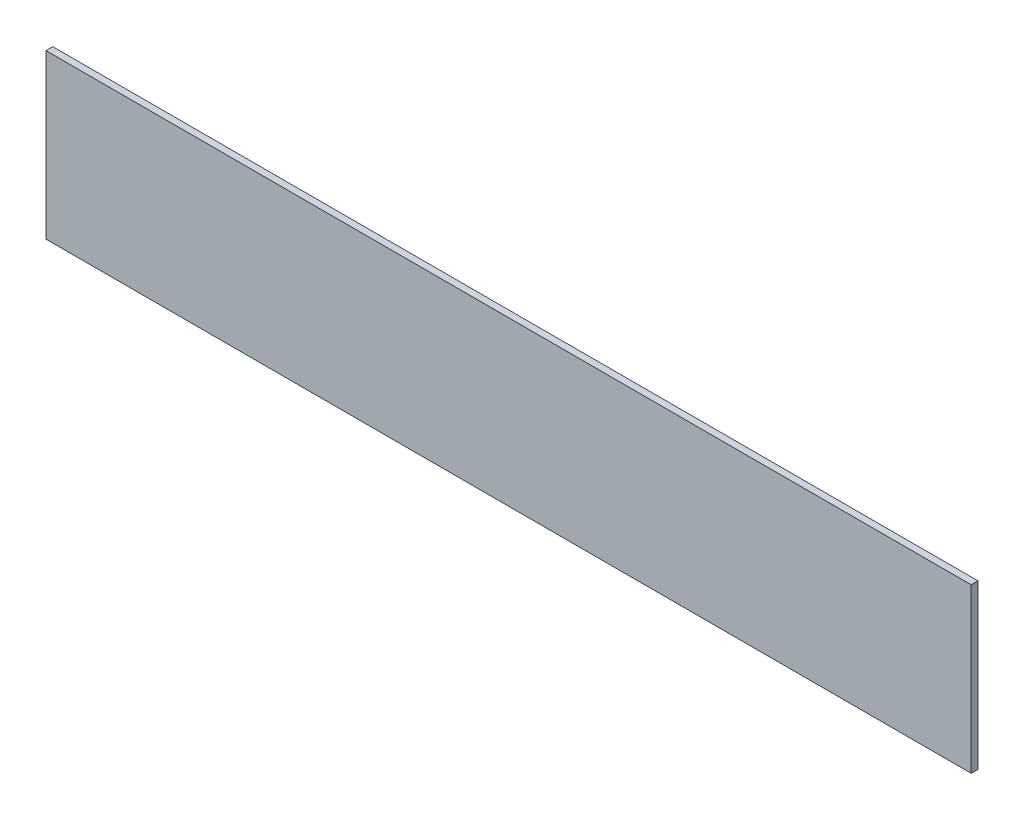
ISO-10303-21;
HEADER;
FILE_DESCRIPTION(('STEP AP214'),'2;1');
FILE_NAME('part.step','',(''),(''),'','','');
FILE_SCHEMA(('AUTOMOTIVE_DESIGN { 1 0 10303 214 1 1 1 1 }'));
ENDSEC;
DATA;
#1=APPLICATION_CONTEXT('core data for automotive mechanical design processes');
#2=APPLICATION_PROTOCOL_DEFINITION('international standard','automotive_design',2000,#1);
#3=PRODUCT_CONTEXT('',#1,'mechanical');
#4=PRODUCT('Part','Part','',(#3));
#5=PRODUCT_RELATED_PRODUCT_CATEGORY('part','',(#4));
#6=PRODUCT_DEFINITION_FORMATION('','',#4);
#7=PRODUCT_DEFINITION_CONTEXT('part definition',#1,'design');
#8=PRODUCT_DEFINITION('design','',#6,#7);
#9=PRODUCT_DEFINITION_SHAPE('','',#8);
#10=(LENGTH_UNIT() NAMED_UNIT(*) SI_UNIT(.MILLI.,.METRE.));
#11=(NAMED_UNIT(*) PLANE_ANGLE_UNIT() SI_UNIT($,.RADIAN.));
#12=(NAMED_UNIT(*) SI_UNIT($,.STERADIAN.) SOLID_ANGLE_UNIT());
#13=UNCERTAINTY_MEASURE_WITH_UNIT(LENGTH_MEASURE(1.E-05),#10,'distance_accuracy_value','');
#14=(GEOMETRIC_REPRESENTATION_CONTEXT(3) GLOBAL_UNCERTAINTY_ASSIGNED_CONTEXT((#13)) GLOBAL_UNIT_ASSIGNED_CONTEXT((#10,
#11,#12)) REPRESENTATION_CONTEXT('',''));
#15=CARTESIAN_POINT('',(0.,0.,0.));
#16=DIRECTION('',(0.,0.,1.));
#17=DIRECTION('',(1.,0.,0.));
#18=AXIS2_PLACEMENT_3D('',#15,#16,#17);
#19=CARTESIAN_POINT('',(-863.6,-152.4,6.35));
#20=DIRECTION('',(-1.,0.,0.));
#21=DIRECTION('',(0.,0.,1.));
#22=AXIS2_PLACEMENT_3D('',#19,#20,#21);
#23=PLANE('',#22);
#24=DIRECTION('',(0.,1.,0.));
#25=VECTOR('',#24,1.);
#26=CARTESIAN_POINT('',(-863.6,-152.4,-6.35));
#27=LINE('',#26,#25);
#28=CARTESIAN_POINT('',(-863.6,-152.4,-6.35));
#29=VERTEX_POINT('',#28);
#30=CARTESIAN_POINT('',(-863.6,152.4,-6.35));
#31=VERTEX_POINT('',#30);
#32=EDGE_CURVE('E118',#29,#31,#27,.T.);
#33=ORIENTED_EDGE('',*,*,#32,.F.);
#34=DIRECTION('',(0.,0.,-1.));
#35=VECTOR('',#34,1.);
#36=CARTESIAN_POINT('',(-863.6,-152.4,6.35));
#37=LINE('',#36,#35);
#38=CARTESIAN_POINT('',(-863.6,-152.4,6.35));
#39=VERTEX_POINT('',#38);
#40=EDGE_CURVE('E11',#39,#29,#37,.T.);
#41=ORIENTED_EDGE('',*,*,#40,.F.);
#42=DIRECTION('',(0.,1.,0.));
#43=VECTOR('',#42,1.);
#44=CARTESIAN_POINT('',(-863.6,-152.4,6.35));
#45=LINE('',#44,#43);
#46=CARTESIAN_POINT('',(-863.6,152.4,6.35));
#47=VERTEX_POINT('',#46);
#48=EDGE_CURVE('E110',#39,#47,#45,.T.);
#49=ORIENTED_EDGE('',*,*,#48,.T.);
#50=DIRECTION('',(0.,0.,-1.));
#51=VECTOR('',#50,1.);
#52=CARTESIAN_POINT('',(-863.6,152.4,6.35));
#53=LINE('',#52,#51);
#54=EDGE_CURVE('E45',#47,#31,#53,.T.);
#55=ORIENTED_EDGE('',*,*,#54,.T.);
#56=EDGE_LOOP('',(#33,#41,#49,#55));
#57=FACE_BOUND('',#56,.T.);
#58=ADVANCED_FACE('F42',(#57),#23,.T.);
#59=CARTESIAN_POINT('',(-863.6,-152.4,6.35));
#60=DIRECTION('',(0.,1.,0.));
#61=DIRECTION('',(0.,0.,1.));
#62=AXIS2_PLACEMENT_3D('',#59,#60,#61);
#63=PLANE('',#62);
#64=DIRECTION('',(1.,0.,0.));
#65=VECTOR('',#64,1.);
#66=CARTESIAN_POINT('',(-863.6,-152.4,-6.35));
#67=LINE('',#66,#65);
#68=CARTESIAN_POINT('',(863.6,-152.4,-6.35));
#69=VERTEX_POINT('',#68);
#70=EDGE_CURVE('E78',#29,#69,#67,.T.);
#71=ORIENTED_EDGE('',*,*,#70,.T.);
#72=DIRECTION('',(0.,0.,-1.));
#73=VECTOR('',#72,1.);
#74=CARTESIAN_POINT('',(863.6,-152.4,6.35));
#75=LINE('',#74,#73);
#76=CARTESIAN_POINT('',(863.6,-152.4,6.35));
#77=VERTEX_POINT('',#76);
#78=EDGE_CURVE('E52',#77,#69,#75,.T.);
#79=ORIENTED_EDGE('',*,*,#78,.F.);
#80=DIRECTION('',(1.,0.,0.));
#81=VECTOR('',#80,1.);
#82=CARTESIAN_POINT('',(-863.6,-152.4,6.35));
#83=LINE('',#82,#81);
#84=EDGE_CURVE('E97',#39,#77,#83,.T.);
#85=ORIENTED_EDGE('',*,*,#84,.F.);
#86=ORIENTED_EDGE('',*,*,#40,.T.);
#87=EDGE_LOOP('',(#71,#79,#85,#86));
#88=FACE_BOUND('',#87,.T.);
#89=ADVANCED_FACE('F152',(#88),#63,.F.);
#90=CARTESIAN_POINT('',(863.6,-152.4,6.35));
#91=DIRECTION('',(-1.,0.,0.));
#92=DIRECTION('',(0.,0.,1.));
#93=AXIS2_PLACEMENT_3D('',#90,#91,#92);
#94=PLANE('',#93);
#95=DIRECTION('',(0.,1.,0.));
#96=VECTOR('',#95,1.);
#97=CARTESIAN_POINT('',(863.6,-152.4,-6.35));
#98=LINE('',#97,#96);
#99=CARTESIAN_POINT('',(863.6,152.4,-6.35));
#100=VERTEX_POINT('',#99);
#101=EDGE_CURVE('E105',#69,#100,#98,.T.);
#102=ORIENTED_EDGE('',*,*,#101,.T.);
#103=DIRECTION('',(0.,0.,-1.));
#104=VECTOR('',#103,1.);
#105=CARTESIAN_POINT('',(863.6,152.4,6.35));
#106=LINE('',#105,#104);
#107=CARTESIAN_POINT('',(863.6,152.4,6.35));
#108=VERTEX_POINT('',#107);
#109=EDGE_CURVE('E102',#108,#100,#106,.T.);
#110=ORIENTED_EDGE('',*,*,#109,.F.);
#111=DIRECTION('',(0.,1.,0.));
#112=VECTOR('',#111,1.);
#113=CARTESIAN_POINT('',(863.6,-152.4,6.35));
#114=LINE('',#113,#112);
#115=EDGE_CURVE('E92',#77,#108,#114,.T.);
#116=ORIENTED_EDGE('',*,*,#115,.F.);
#117=ORIENTED_EDGE('',*,*,#78,.T.);
#118=EDGE_LOOP('',(#102,#110,#116,#117));
#119=FACE_BOUND('',#118,.T.);
#120=ADVANCED_FACE('F103',(#119),#94,.F.);
#121=CARTESIAN_POINT('',(-863.6,152.4,6.35));
#122=DIRECTION('',(0.,1.,0.));
#123=DIRECTION('',(0.,0.,1.));
#124=AXIS2_PLACEMENT_3D('',#121,#122,#123);
#125=PLANE('',#124);
#126=DIRECTION('',(1.,0.,0.));
#127=VECTOR('',#126,1.);
#128=CARTESIAN_POINT('',(-863.6,152.4,-6.35));
#129=LINE('',#128,#127);
#130=EDGE_CURVE('E122',#31,#100,#129,.T.);
#131=ORIENTED_EDGE('',*,*,#130,.F.);
#132=ORIENTED_EDGE('',*,*,#54,.F.);
#133=DIRECTION('',(1.,0.,0.));
#134=VECTOR('',#133,1.);
#135=CARTESIAN_POINT('',(-863.6,152.4,6.35));
#136=LINE('',#135,#134);
#137=EDGE_CURVE('E96',#47,#108,#136,.T.);
#138=ORIENTED_EDGE('',*,*,#137,.T.);
#139=ORIENTED_EDGE('',*,*,#109,.T.);
#140=EDGE_LOOP('',(#131,#132,#138,#139));
#141=FACE_BOUND('',#140,.T.);
#142=ADVANCED_FACE('F108',(#141),#125,.T.);
#143=CARTESIAN_POINT('',(0.,0.,6.35));
#144=DIRECTION('',(0.,0.,-1.));
#145=DIRECTION('',(-1.,0.,0.));
#146=AXIS2_PLACEMENT_3D('',#143,#144,#145);
#147=PLANE('',#146);
#148=ORIENTED_EDGE('',*,*,#48,.F.);
#149=ORIENTED_EDGE('',*,*,#84,.T.);
#150=ORIENTED_EDGE('',*,*,#115,.T.);
#151=ORIENTED_EDGE('',*,*,#137,.F.);
#152=EDGE_LOOP('',(#148,#149,#150,#151));
#153=FACE_BOUND('',#152,.T.);
#154=ADVANCED_FACE('F95',(#153),#147,.F.);
#155=CARTESIAN_POINT('',(0.,0.,-6.35));
#156=DIRECTION('',(0.,0.,-1.));
#157=DIRECTION('',(-1.,0.,0.));
#158=AXIS2_PLACEMENT_3D('',#155,#156,#157);
#159=PLANE('',#158);
#160=ORIENTED_EDGE('',*,*,#32,.T.);
#161=ORIENTED_EDGE('',*,*,#130,.T.);
#162=ORIENTED_EDGE('',*,*,#101,.F.);
#163=ORIENTED_EDGE('',*,*,#70,.F.);
#164=EDGE_LOOP('',(#160,#161,#162,#163));
#165=FACE_BOUND('',#164,.T.);
#166=ADVANCED_FACE('F133',(#165),#159,.T.);
#167=CLOSED_SHELL('',(#58,#89,#120,#142,#154,#166));
#168=MANIFOLD_SOLID_BREP('B2',#167);
#169=ADVANCED_BREP_SHAPE_REPRESENTATION('',(#18,#168),#14);
#170=SHAPE_DEFINITION_REPRESENTATION(#9,#169);
ENDSEC;
END-ISO-10303-21;
